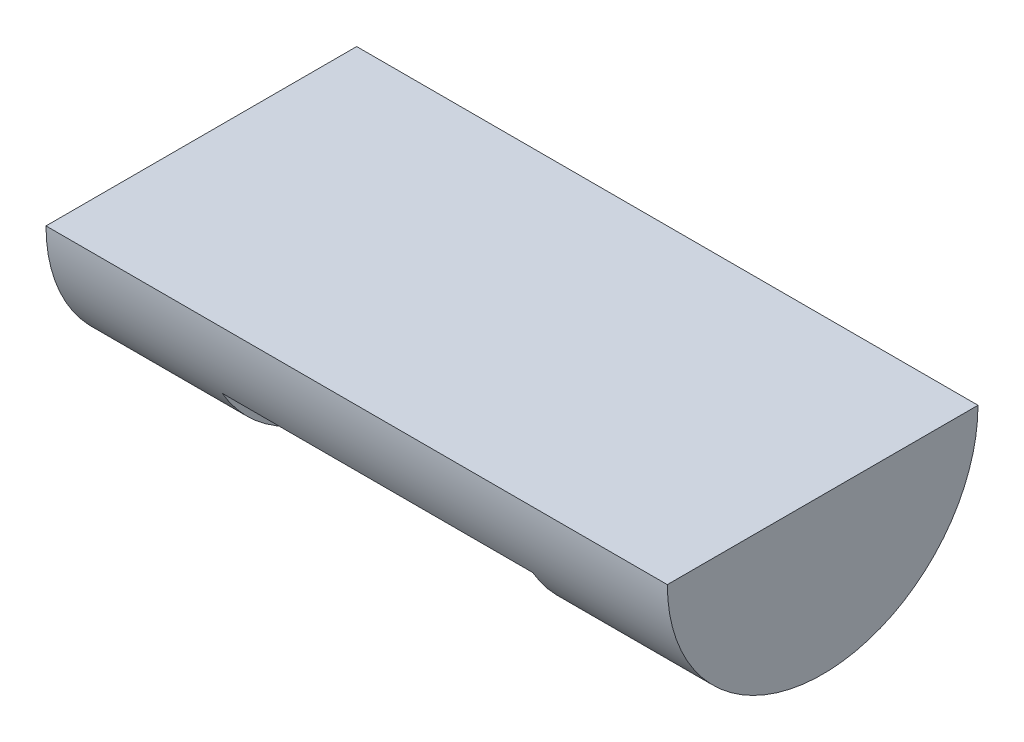
ISO-10303-21;
HEADER;
FILE_DESCRIPTION(('STEP AP214'),'2;1');
FILE_NAME('part.step','',(''),(''),'','','');
FILE_SCHEMA(('AUTOMOTIVE_DESIGN { 1 0 10303 214 1 1 1 1 }'));
ENDSEC;
DATA;
#1=APPLICATION_CONTEXT('core data for automotive mechanical design processes');
#2=APPLICATION_PROTOCOL_DEFINITION('international standard','automotive_design',2000,#1);
#3=PRODUCT_CONTEXT('',#1,'mechanical');
#4=PRODUCT('Part','Part','',(#3));
#5=PRODUCT_RELATED_PRODUCT_CATEGORY('part','',(#4));
#6=PRODUCT_DEFINITION_FORMATION('','',#4);
#7=PRODUCT_DEFINITION_CONTEXT('part definition',#1,'design');
#8=PRODUCT_DEFINITION('design','',#6,#7);
#9=PRODUCT_DEFINITION_SHAPE('','',#8);
#10=(LENGTH_UNIT() NAMED_UNIT(*) SI_UNIT(.MILLI.,.METRE.));
#11=(NAMED_UNIT(*) PLANE_ANGLE_UNIT() SI_UNIT($,.RADIAN.));
#12=(NAMED_UNIT(*) SI_UNIT($,.STERADIAN.) SOLID_ANGLE_UNIT());
#13=UNCERTAINTY_MEASURE_WITH_UNIT(LENGTH_MEASURE(1.E-05),#10,'distance_accuracy_value','');
#14=(GEOMETRIC_REPRESENTATION_CONTEXT(3) GLOBAL_UNCERTAINTY_ASSIGNED_CONTEXT((#13)) GLOBAL_UNIT_ASSIGNED_CONTEXT((#10,
#11,#12)) REPRESENTATION_CONTEXT('',''));
#15=CARTESIAN_POINT('',(0.,0.,0.));
#16=DIRECTION('',(0.,0.,1.));
#17=DIRECTION('',(1.,0.,0.));
#18=AXIS2_PLACEMENT_3D('',#15,#16,#17);
#19=CARTESIAN_POINT('',(914.4,0.,0.));
#20=DIRECTION('',(-1.,0.,0.));
#21=DIRECTION('',(0.,0.,1.));
#22=AXIS2_PLACEMENT_3D('',#19,#20,#21);
#23=CYLINDRICAL_SURFACE('',#22,152.4);
#24=CARTESIAN_POINT('',(304.8,0.,0.));
#25=DIRECTION('',(-1.,0.,0.));
#26=DIRECTION('',(0.,-1.,0.));
#27=AXIS2_PLACEMENT_3D('',#24,#25,#26);
#28=CIRCLE('',#27,152.4);
#29=CARTESIAN_POINT('',(304.8,-76.2,-131.982271536748));
#30=VERTEX_POINT('',#29);
#31=CARTESIAN_POINT('',(304.8,-76.2,131.982271536748));
#32=VERTEX_POINT('',#31);
#33=EDGE_CURVE('E11',#30,#32,#28,.T.);
#34=ORIENTED_EDGE('',*,*,#33,.T.);
#35=DIRECTION('',(-1.,0.,0.));
#36=VECTOR('',#35,1.);
#37=CARTESIAN_POINT('',(914.4,-76.2,131.982271536748));
#38=LINE('',#37,#36);
#39=CARTESIAN_POINT('',(609.6,-76.2,131.982271536748));
#40=VERTEX_POINT('',#39);
#41=EDGE_CURVE('E92',#32,#40,#38,.F.);
#42=ORIENTED_EDGE('',*,*,#41,.T.);
#43=CARTESIAN_POINT('',(609.6,0.,0.));
#44=DIRECTION('',(1.,0.,0.));
#45=DIRECTION('',(0.,0.,-1.));
#46=AXIS2_PLACEMENT_3D('',#43,#44,#45);
#47=CIRCLE('',#46,152.4);
#48=CARTESIAN_POINT('',(609.6,-76.2,-131.982271536748));
#49=VERTEX_POINT('',#48);
#50=EDGE_CURVE('E83',#40,#49,#47,.T.);
#51=ORIENTED_EDGE('',*,*,#50,.T.);
#52=DIRECTION('',(-1.,0.,0.));
#53=VECTOR('',#52,1.);
#54=CARTESIAN_POINT('',(914.4,-76.2,-131.982271536748));
#55=LINE('',#54,#53);
#56=EDGE_CURVE('E39',#49,#30,#55,.T.);
#57=ORIENTED_EDGE('',*,*,#56,.T.);
#58=EDGE_LOOP('',(#34,#42,#51,#57));
#59=FACE_BOUND('',#58,.T.);
#60=CARTESIAN_POINT('',(762.,0.,0.));
#61=DIRECTION('',(-1.,0.,0.));
#62=DIRECTION('',(0.,0.,1.));
#63=AXIS2_PLACEMENT_3D('',#60,#61,#62);
#64=CIRCLE('',#63,152.4);
#65=CARTESIAN_POINT('',(762.,0.,-152.4));
#66=VERTEX_POINT('',#65);
#67=CARTESIAN_POINT('',(762.,0.,152.4));
#68=VERTEX_POINT('',#67);
#69=EDGE_CURVE('E45',#66,#68,#64,.T.);
#70=ORIENTED_EDGE('',*,*,#69,.T.);
#71=DIRECTION('',(-1.,0.,0.));
#72=VECTOR('',#71,1.);
#73=CARTESIAN_POINT('',(914.4,0.,152.4));
#74=LINE('',#73,#72);
#75=CARTESIAN_POINT('',(152.4,0.,152.4));
#76=VERTEX_POINT('',#75);
#77=EDGE_CURVE('E52',#68,#76,#74,.T.);
#78=ORIENTED_EDGE('',*,*,#77,.T.);
#79=CARTESIAN_POINT('',(152.4,0.,0.));
#80=DIRECTION('',(-1.,0.,0.));
#81=DIRECTION('',(0.,0.,1.));
#82=AXIS2_PLACEMENT_3D('',#79,#80,#81);
#83=CIRCLE('',#82,152.4);
#84=CARTESIAN_POINT('',(152.4,0.,-152.4));
#85=VERTEX_POINT('',#84);
#86=EDGE_CURVE('E73',#85,#76,#83,.T.);
#87=ORIENTED_EDGE('',*,*,#86,.F.);
#88=DIRECTION('',(-1.,0.,0.));
#89=VECTOR('',#88,1.);
#90=CARTESIAN_POINT('',(914.4,0.,-152.4));
#91=LINE('',#90,#89);
#92=EDGE_CURVE('E75',#66,#85,#91,.T.);
#93=ORIENTED_EDGE('',*,*,#92,.F.);
#94=EDGE_LOOP('',(#70,#78,#87,#93));
#95=FACE_BOUND('',#94,.T.);
#96=ADVANCED_FACE('F32',(#59,#95),#23,.T.);
#97=CARTESIAN_POINT('',(914.4,0.,-152.4));
#98=DIRECTION('',(0.,-1.,0.));
#99=DIRECTION('',(0.,0.,-1.));
#100=AXIS2_PLACEMENT_3D('',#97,#98,#99);
#101=PLANE('',#100);
#102=DIRECTION('',(0.,0.,-1.));
#103=VECTOR('',#102,1.);
#104=CARTESIAN_POINT('',(762.,0.,152.4));
#105=LINE('',#104,#103);
#106=EDGE_CURVE('E69',#68,#66,#105,.T.);
#107=ORIENTED_EDGE('',*,*,#106,.T.);
#108=ORIENTED_EDGE('',*,*,#92,.T.);
#109=DIRECTION('',(0.,0.,-1.));
#110=VECTOR('',#109,1.);
#111=CARTESIAN_POINT('',(152.4,0.,152.4));
#112=LINE('',#111,#110);
#113=EDGE_CURVE('E80',#76,#85,#112,.T.);
#114=ORIENTED_EDGE('',*,*,#113,.F.);
#115=ORIENTED_EDGE('',*,*,#77,.F.);
#116=EDGE_LOOP('',(#107,#108,#114,#115));
#117=FACE_BOUND('',#116,.T.);
#118=ADVANCED_FACE('F78',(#117),#101,.F.);
#119=CARTESIAN_POINT('',(304.8,-152.4,-152.4));
#120=DIRECTION('',(-1.,0.,0.));
#121=DIRECTION('',(0.,-1.,0.));
#122=AXIS2_PLACEMENT_3D('',#119,#120,#121);
#123=PLANE('',#122);
#124=ORIENTED_EDGE('',*,*,#33,.F.);
#125=DIRECTION('',(0.,0.,1.));
#126=VECTOR('',#125,1.);
#127=CARTESIAN_POINT('',(304.8,-76.2,-152.4));
#128=LINE('',#127,#126);
#129=EDGE_CURVE('E81',#30,#32,#128,.T.);
#130=ORIENTED_EDGE('',*,*,#129,.T.);
#131=EDGE_LOOP('',(#124,#130));
#132=FACE_BOUND('',#131,.T.);
#133=ADVANCED_FACE('F103',(#132),#123,.F.);
#134=CARTESIAN_POINT('',(304.8,-76.2,-152.4));
#135=DIRECTION('',(0.,1.,0.));
#136=DIRECTION('',(-1.,0.,0.));
#137=AXIS2_PLACEMENT_3D('',#134,#135,#136);
#138=PLANE('',#137);
#139=DIRECTION('',(0.,0.,1.));
#140=VECTOR('',#139,1.);
#141=CARTESIAN_POINT('',(609.6,-76.2,-152.4));
#142=LINE('',#141,#140);
#143=EDGE_CURVE('E86',#49,#40,#142,.T.);
#144=ORIENTED_EDGE('',*,*,#143,.T.);
#145=ORIENTED_EDGE('',*,*,#41,.F.);
#146=ORIENTED_EDGE('',*,*,#129,.F.);
#147=ORIENTED_EDGE('',*,*,#56,.F.);
#148=EDGE_LOOP('',(#144,#145,#146,#147));
#149=FACE_BOUND('',#148,.T.);
#150=ADVANCED_FACE('F101',(#149),#138,.F.);
#151=CARTESIAN_POINT('',(609.6,-76.2,-152.4));
#152=DIRECTION('',(1.,0.,0.));
#153=DIRECTION('',(0.,0.,-1.));
#154=AXIS2_PLACEMENT_3D('',#151,#152,#153);
#155=PLANE('',#154);
#156=ORIENTED_EDGE('',*,*,#143,.F.);
#157=ORIENTED_EDGE('',*,*,#50,.F.);
#158=EDGE_LOOP('',(#156,#157));
#159=FACE_BOUND('',#158,.T.);
#160=ADVANCED_FACE('F110',(#159),#155,.F.);
#161=CARTESIAN_POINT('',(152.4,0.,0.));
#162=DIRECTION('',(-1.,0.,0.));
#163=DIRECTION('',(0.,0.,1.));
#164=AXIS2_PLACEMENT_3D('',#161,#162,#163);
#165=PLANE('',#164);
#166=ORIENTED_EDGE('',*,*,#86,.T.);
#167=ORIENTED_EDGE('',*,*,#113,.T.);
#168=EDGE_LOOP('',(#166,#167));
#169=FACE_BOUND('',#168,.T.);
#170=ADVANCED_FACE('F130',(#169),#165,.T.);
#171=CARTESIAN_POINT('',(762.,0.,0.));
#172=DIRECTION('',(1.,0.,0.));
#173=DIRECTION('',(0.,0.,1.));
#174=AXIS2_PLACEMENT_3D('',#171,#172,#173);
#175=PLANE('',#174);
#176=ORIENTED_EDGE('',*,*,#69,.F.);
#177=ORIENTED_EDGE('',*,*,#106,.F.);
#178=EDGE_LOOP('',(#176,#177));
#179=FACE_BOUND('',#178,.T.);
#180=ADVANCED_FACE('F70',(#179),#175,.T.);
#181=CLOSED_SHELL('',(#96,#118,#133,#150,#160,#170,#180));
#182=MANIFOLD_SOLID_BREP('B2',#181);
#183=ADVANCED_BREP_SHAPE_REPRESENTATION('',(#18,#182),#14);
#184=SHAPE_DEFINITION_REPRESENTATION(#9,#183);
ENDSEC;
END-ISO-10303-21;
